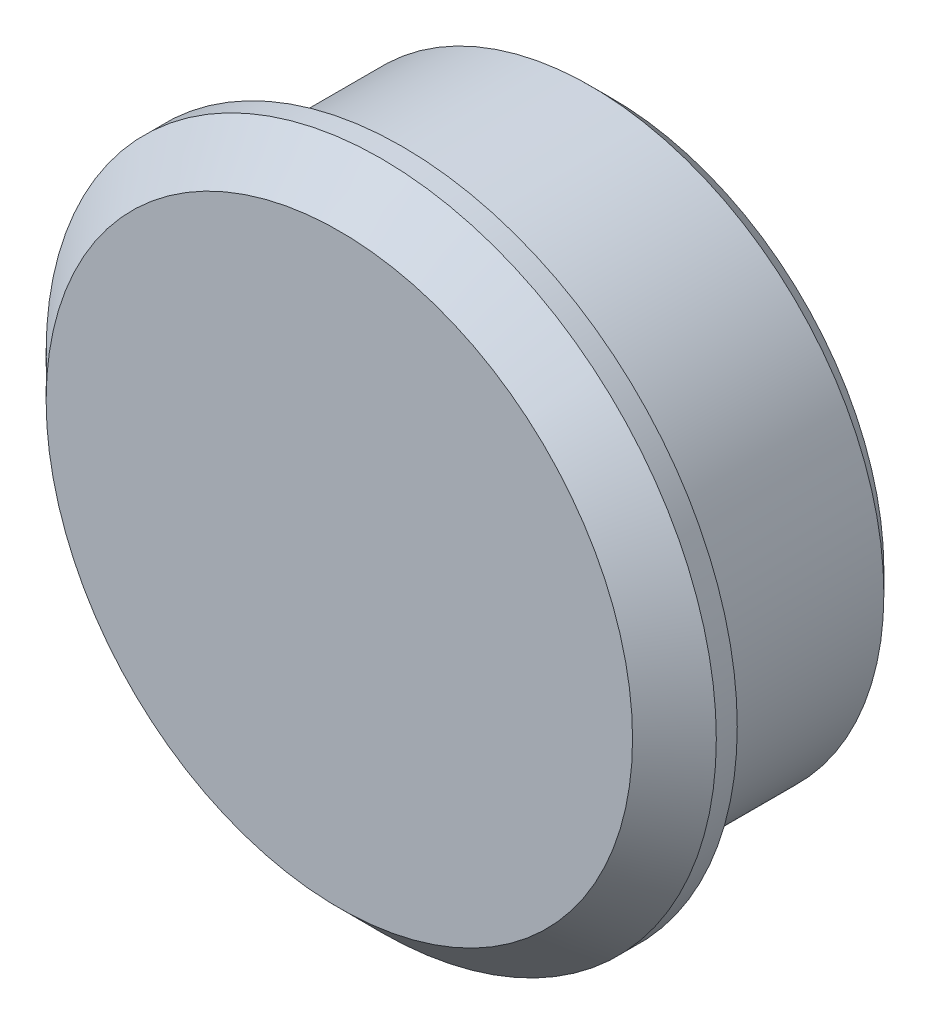
ISO-10303-21;
HEADER;
FILE_DESCRIPTION(('STEP AP214'),'2;1');
FILE_NAME('part.step','',(''),(''),'','','');
FILE_SCHEMA(('AUTOMOTIVE_DESIGN { 1 0 10303 214 1 1 1 1 }'));
ENDSEC;
DATA;
#1=APPLICATION_CONTEXT('core data for automotive mechanical design processes');
#2=APPLICATION_PROTOCOL_DEFINITION('international standard','automotive_design',2000,#1);
#3=PRODUCT_CONTEXT('',#1,'mechanical');
#4=PRODUCT('Part','Part','',(#3));
#5=PRODUCT_RELATED_PRODUCT_CATEGORY('part','',(#4));
#6=PRODUCT_DEFINITION_FORMATION('','',#4);
#7=PRODUCT_DEFINITION_CONTEXT('part definition',#1,'design');
#8=PRODUCT_DEFINITION('design','',#6,#7);
#9=PRODUCT_DEFINITION_SHAPE('','',#8);
#10=(LENGTH_UNIT() NAMED_UNIT(*) SI_UNIT(.MILLI.,.METRE.));
#11=(NAMED_UNIT(*) PLANE_ANGLE_UNIT() SI_UNIT($,.RADIAN.));
#12=(NAMED_UNIT(*) SI_UNIT($,.STERADIAN.) SOLID_ANGLE_UNIT());
#13=UNCERTAINTY_MEASURE_WITH_UNIT(LENGTH_MEASURE(1.E-05),#10,'distance_accuracy_value','');
#14=(GEOMETRIC_REPRESENTATION_CONTEXT(3) GLOBAL_UNCERTAINTY_ASSIGNED_CONTEXT((#13)) GLOBAL_UNIT_ASSIGNED_CONTEXT((#10,
#11,#12)) REPRESENTATION_CONTEXT('',''));
#15=CARTESIAN_POINT('',(0.,0.,0.));
#16=DIRECTION('',(0.,0.,1.));
#17=DIRECTION('',(1.,0.,0.));
#18=AXIS2_PLACEMENT_3D('',#15,#16,#17);
#19=CARTESIAN_POINT('',(0.,0.,0.));
#20=DIRECTION('',(0.,0.,-1.));
#21=DIRECTION('',(-1.,0.,0.));
#22=AXIS2_PLACEMENT_3D('',#19,#20,#21);
#23=PLANE('',#22);
#24=CARTESIAN_POINT('',(0.,0.,0.));
#25=DIRECTION('',(0.,0.,1.));
#26=DIRECTION('',(1.,0.,0.));
#27=AXIS2_PLACEMENT_3D('',#24,#25,#26);
#28=CIRCLE('',#27,14.);
#29=CARTESIAN_POINT('',(14.,0.,0.));
#30=VERTEX_POINT('',#29);
#31=EDGE_CURVE('E10',#30,#30,#28,.T.);
#32=ORIENTED_EDGE('',*,*,#31,.T.);
#33=EDGE_LOOP('',(#32));
#34=FACE_BOUND('',#33,.T.);
#35=ADVANCED_FACE('F28',(#34),#23,.F.);
#36=CARTESIAN_POINT('',(0.,0.,-2.));
#37=DIRECTION('',(0.,0.,-1.));
#38=DIRECTION('',(-1.,0.,0.));
#39=AXIS2_PLACEMENT_3D('',#36,#37,#38);
#40=CONICAL_SURFACE('',#39,16.,0.785398163397447);
#41=ORIENTED_EDGE('',*,*,#31,.F.);
#42=EDGE_LOOP('',(#41));
#43=FACE_BOUND('',#42,.T.);
#44=CARTESIAN_POINT('',(0.,0.,-2.));
#45=DIRECTION('',(0.,0.,1.));
#46=DIRECTION('',(1.,0.,0.));
#47=AXIS2_PLACEMENT_3D('',#44,#45,#46);
#48=CIRCLE('',#47,16.);
#49=CARTESIAN_POINT('',(16.,0.,-2.));
#50=VERTEX_POINT('',#49);
#51=EDGE_CURVE('E34',#50,#50,#48,.T.);
#52=ORIENTED_EDGE('',*,*,#51,.T.);
#53=EDGE_LOOP('',(#52));
#54=FACE_BOUND('',#53,.T.);
#55=ADVANCED_FACE('F72',(#43,#54),#40,.T.);
#56=CARTESIAN_POINT('',(0.,0.,0.));
#57=DIRECTION('',(0.,0.,1.));
#58=DIRECTION('',(1.,0.,0.));
#59=AXIS2_PLACEMENT_3D('',#56,#57,#58);
#60=CYLINDRICAL_SURFACE('',#59,16.);
#61=ORIENTED_EDGE('',*,*,#51,.F.);
#62=EDGE_LOOP('',(#61));
#63=FACE_BOUND('',#62,.T.);
#64=CARTESIAN_POINT('',(0.,0.,-3.));
#65=DIRECTION('',(0.,0.,1.));
#66=DIRECTION('',(1.,0.,0.));
#67=AXIS2_PLACEMENT_3D('',#64,#65,#66);
#68=CIRCLE('',#67,16.);
#69=CARTESIAN_POINT('',(16.,0.,-3.));
#70=VERTEX_POINT('',#69);
#71=EDGE_CURVE('E38',#70,#70,#68,.T.);
#72=ORIENTED_EDGE('',*,*,#71,.T.);
#73=EDGE_LOOP('',(#72));
#74=FACE_BOUND('',#73,.T.);
#75=ADVANCED_FACE('F76',(#63,#74),#60,.T.);
#76=CARTESIAN_POINT('',(0.,16.,-3.));
#77=DIRECTION('',(0.,0.,1.));
#78=DIRECTION('',(1.,0.,0.));
#79=AXIS2_PLACEMENT_3D('',#76,#77,#78);
#80=PLANE('',#79);
#81=ORIENTED_EDGE('',*,*,#71,.F.);
#82=EDGE_LOOP('',(#81));
#83=FACE_BOUND('',#82,.T.);
#84=CARTESIAN_POINT('',(0.,0.,-3.));
#85=DIRECTION('',(0.,0.,1.));
#86=DIRECTION('',(1.,0.,0.));
#87=AXIS2_PLACEMENT_3D('',#84,#85,#86);
#88=CIRCLE('',#87,14.);
#89=CARTESIAN_POINT('',(14.,0.,-3.));
#90=VERTEX_POINT('',#89);
#91=EDGE_CURVE('E42',#90,#90,#88,.T.);
#92=ORIENTED_EDGE('',*,*,#91,.T.);
#93=EDGE_LOOP('',(#92));
#94=FACE_BOUND('',#93,.T.);
#95=ADVANCED_FACE('F81',(#83,#94),#80,.F.);
#96=CARTESIAN_POINT('',(0.,0.,0.));
#97=DIRECTION('',(0.,0.,1.));
#98=DIRECTION('',(1.,0.,0.));
#99=AXIS2_PLACEMENT_3D('',#96,#97,#98);
#100=CYLINDRICAL_SURFACE('',#99,14.);
#101=ORIENTED_EDGE('',*,*,#91,.F.);
#102=EDGE_LOOP('',(#101));
#103=FACE_BOUND('',#102,.T.);
#104=CARTESIAN_POINT('',(0.,0.,-12.));
#105=DIRECTION('',(0.,0.,1.));
#106=DIRECTION('',(1.,0.,0.));
#107=AXIS2_PLACEMENT_3D('',#104,#105,#106);
#108=CIRCLE('',#107,14.);
#109=CARTESIAN_POINT('',(14.,0.,-12.));
#110=VERTEX_POINT('',#109);
#111=EDGE_CURVE('E47',#110,#110,#108,.T.);
#112=ORIENTED_EDGE('',*,*,#111,.T.);
#113=EDGE_LOOP('',(#112));
#114=FACE_BOUND('',#113,.T.);
#115=ADVANCED_FACE('F87',(#103,#114),#100,.T.);
#116=CARTESIAN_POINT('',(0.,0.,-13.));
#117=DIRECTION('',(0.,0.,1.));
#118=DIRECTION('',(1.,0.,0.));
#119=AXIS2_PLACEMENT_3D('',#116,#117,#118);
#120=CONICAL_SURFACE('',#119,13.,0.785398163397448);
#121=ORIENTED_EDGE('',*,*,#111,.F.);
#122=EDGE_LOOP('',(#121));
#123=FACE_BOUND('',#122,.T.);
#124=CARTESIAN_POINT('',(0.,0.,-13.));
#125=DIRECTION('',(0.,0.,1.));
#126=DIRECTION('',(1.,0.,0.));
#127=AXIS2_PLACEMENT_3D('',#124,#125,#126);
#128=CIRCLE('',#127,13.);
#129=CARTESIAN_POINT('',(13.,0.,-13.));
#130=VERTEX_POINT('',#129);
#131=EDGE_CURVE('E50',#130,#130,#128,.T.);
#132=ORIENTED_EDGE('',*,*,#131,.T.);
#133=EDGE_LOOP('',(#132));
#134=FACE_BOUND('',#133,.T.);
#135=ADVANCED_FACE('F91',(#123,#134),#120,.T.);
#136=CARTESIAN_POINT('',(0.,13.,-13.));
#137=DIRECTION('',(0.,0.,1.));
#138=DIRECTION('',(1.,0.,0.));
#139=AXIS2_PLACEMENT_3D('',#136,#137,#138);
#140=PLANE('',#139);
#141=ORIENTED_EDGE('',*,*,#131,.F.);
#142=EDGE_LOOP('',(#141));
#143=FACE_BOUND('',#142,.T.);
#144=CARTESIAN_POINT('',(0.,0.,-13.));
#145=DIRECTION('',(0.,0.,1.));
#146=DIRECTION('',(1.,0.,0.));
#147=AXIS2_PLACEMENT_3D('',#144,#145,#146);
#148=CIRCLE('',#147,11.);
#149=CARTESIAN_POINT('',(11.,0.,-13.));
#150=VERTEX_POINT('',#149);
#151=EDGE_CURVE('E53',#150,#150,#148,.T.);
#152=ORIENTED_EDGE('',*,*,#151,.T.);
#153=EDGE_LOOP('',(#152));
#154=FACE_BOUND('',#153,.T.);
#155=ADVANCED_FACE('F68',(#143,#154),#140,.F.);
#156=CARTESIAN_POINT('',(0.,0.,0.));
#157=DIRECTION('',(0.,0.,1.));
#158=DIRECTION('',(1.,0.,0.));
#159=AXIS2_PLACEMENT_3D('',#156,#157,#158);
#160=CYLINDRICAL_SURFACE('',#159,11.);
#161=ORIENTED_EDGE('',*,*,#151,.F.);
#162=EDGE_LOOP('',(#161));
#163=FACE_BOUND('',#162,.T.);
#164=CARTESIAN_POINT('',(0.,0.,-3.));
#165=DIRECTION('',(0.,0.,1.));
#166=DIRECTION('',(1.,0.,0.));
#167=AXIS2_PLACEMENT_3D('',#164,#165,#166);
#168=CIRCLE('',#167,11.);
#169=CARTESIAN_POINT('',(11.,0.,-3.));
#170=VERTEX_POINT('',#169);
#171=EDGE_CURVE('E56',#170,#170,#168,.T.);
#172=ORIENTED_EDGE('',*,*,#171,.T.);
#173=EDGE_LOOP('',(#172));
#174=FACE_BOUND('',#173,.T.);
#175=ADVANCED_FACE('F60',(#163,#174),#160,.F.);
#176=CARTESIAN_POINT('',(0.,11.,-3.));
#177=DIRECTION('',(0.,0.,1.));
#178=DIRECTION('',(1.,0.,0.));
#179=AXIS2_PLACEMENT_3D('',#176,#177,#178);
#180=PLANE('',#179);
#181=ORIENTED_EDGE('',*,*,#171,.F.);
#182=EDGE_LOOP('',(#181));
#183=FACE_BOUND('',#182,.T.);
#184=ADVANCED_FACE('F62',(#183),#180,.F.);
#185=CLOSED_SHELL('',(#35,#55,#75,#95,#115,#135,#155,#175,#184));
#186=MANIFOLD_SOLID_BREP('B2',#185);
#187=ADVANCED_BREP_SHAPE_REPRESENTATION('',(#18,#186),#14);
#188=SHAPE_DEFINITION_REPRESENTATION(#9,#187);
ENDSEC;
END-ISO-10303-21;
